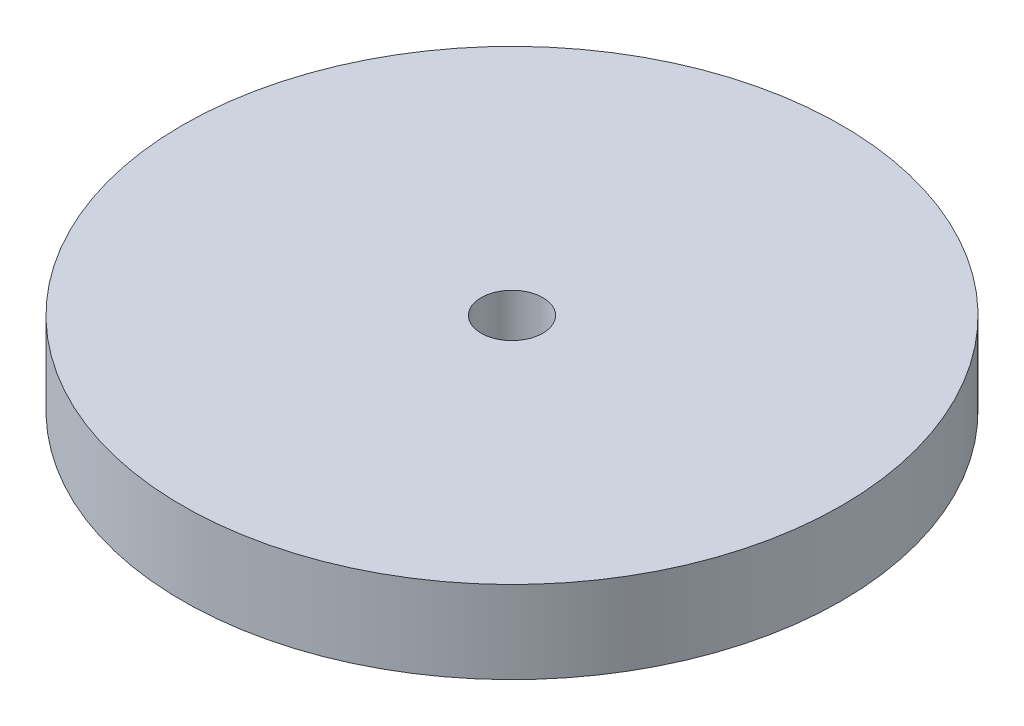
ISO-10303-21;
HEADER;
FILE_DESCRIPTION(('STEP AP214'),'2;1');
FILE_NAME('part.step','',(''),(''),'','','');
FILE_SCHEMA(('AUTOMOTIVE_DESIGN { 1 0 10303 214 1 1 1 1 }'));
ENDSEC;
DATA;
#1=APPLICATION_CONTEXT('core data for automotive mechanical design processes');
#2=APPLICATION_PROTOCOL_DEFINITION('international standard','automotive_design',2000,#1);
#3=PRODUCT_CONTEXT('',#1,'mechanical');
#4=PRODUCT('Part','Part','',(#3));
#5=PRODUCT_RELATED_PRODUCT_CATEGORY('part','',(#4));
#6=PRODUCT_DEFINITION_FORMATION('','',#4);
#7=PRODUCT_DEFINITION_CONTEXT('part definition',#1,'design');
#8=PRODUCT_DEFINITION('design','',#6,#7);
#9=PRODUCT_DEFINITION_SHAPE('','',#8);
#10=(LENGTH_UNIT() NAMED_UNIT(*) SI_UNIT(.MILLI.,.METRE.));
#11=(NAMED_UNIT(*) PLANE_ANGLE_UNIT() SI_UNIT($,.RADIAN.));
#12=(NAMED_UNIT(*) SI_UNIT($,.STERADIAN.) SOLID_ANGLE_UNIT());
#13=UNCERTAINTY_MEASURE_WITH_UNIT(LENGTH_MEASURE(1.E-05),#10,'distance_accuracy_value','');
#14=(GEOMETRIC_REPRESENTATION_CONTEXT(3) GLOBAL_UNCERTAINTY_ASSIGNED_CONTEXT((#13)) GLOBAL_UNIT_ASSIGNED_CONTEXT((#10,
#11,#12)) REPRESENTATION_CONTEXT('',''));
#15=CARTESIAN_POINT('',(0.,0.,0.));
#16=DIRECTION('',(0.,0.,1.));
#17=DIRECTION('',(1.,0.,0.));
#18=AXIS2_PLACEMENT_3D('',#15,#16,#17);
#19=CARTESIAN_POINT('',(-38.1,4.7625,76.2));
#20=DIRECTION('',(0.,-1.,0.));
#21=DIRECTION('',(1.,0.,0.));
#22=AXIS2_PLACEMENT_3D('',#19,#20,#21);
#23=PLANE('',#22);
#24=CARTESIAN_POINT('',(0.,4.7625,38.1));
#25=DIRECTION('',(0.,1.,0.));
#26=DIRECTION('',(-1.,0.,0.));
#27=AXIS2_PLACEMENT_3D('',#24,#25,#26);
#28=CIRCLE('',#27,3.5687);
#29=CARTESIAN_POINT('',(-3.56870000000001,4.7625,38.1));
#30=VERTEX_POINT('',#29);
#31=EDGE_CURVE('E46',#30,#30,#28,.T.);
#32=ORIENTED_EDGE('',*,*,#31,.F.);
#33=EDGE_LOOP('',(#32));
#34=FACE_BOUND('',#33,.T.);
#35=CARTESIAN_POINT('',(0.,4.7625,38.1));
#36=DIRECTION('',(0.,1.,0.));
#37=DIRECTION('',(-1.,0.,0.));
#38=AXIS2_PLACEMENT_3D('',#35,#36,#37);
#39=CIRCLE('',#38,38.1);
#40=CARTESIAN_POINT('',(-38.1,4.7625,38.1));
#41=VERTEX_POINT('',#40);
#42=EDGE_CURVE('E57',#41,#41,#39,.T.);
#43=ORIENTED_EDGE('',*,*,#42,.T.);
#44=EDGE_LOOP('',(#43));
#45=FACE_BOUND('',#44,.T.);
#46=ADVANCED_FACE('F43',(#34,#45),#23,.F.);
#47=CARTESIAN_POINT('',(-38.1,-4.7625,76.2));
#48=DIRECTION('',(0.,1.,0.));
#49=DIRECTION('',(0.,0.,1.));
#50=AXIS2_PLACEMENT_3D('',#47,#48,#49);
#51=PLANE('',#50);
#52=CARTESIAN_POINT('',(0.,-4.7625,38.1));
#53=DIRECTION('',(0.,1.,0.));
#54=DIRECTION('',(-1.,0.,0.));
#55=AXIS2_PLACEMENT_3D('',#52,#53,#54);
#56=CIRCLE('',#55,3.5687);
#57=CARTESIAN_POINT('',(-3.56870000000001,-4.7625,38.1));
#58=VERTEX_POINT('',#57);
#59=EDGE_CURVE('E10',#58,#58,#56,.T.);
#60=ORIENTED_EDGE('',*,*,#59,.T.);
#61=EDGE_LOOP('',(#60));
#62=FACE_BOUND('',#61,.T.);
#63=CARTESIAN_POINT('',(0.,-4.7625,38.1));
#64=DIRECTION('',(0.,1.,0.));
#65=DIRECTION('',(0.,0.,1.));
#66=AXIS2_PLACEMENT_3D('',#63,#64,#65);
#67=CIRCLE('',#66,38.1);
#68=CARTESIAN_POINT('',(-38.1,-4.7625,38.1));
#69=VERTEX_POINT('',#68);
#70=EDGE_CURVE('E53',#69,#69,#67,.T.);
#71=ORIENTED_EDGE('',*,*,#70,.F.);
#72=EDGE_LOOP('',(#71));
#73=FACE_BOUND('',#72,.T.);
#74=ADVANCED_FACE('F69',(#62,#73),#51,.F.);
#75=CARTESIAN_POINT('',(0.,-4.7625,38.1));
#76=DIRECTION('',(0.,1.,0.));
#77=DIRECTION('',(-1.,0.,0.));
#78=AXIS2_PLACEMENT_3D('',#75,#76,#77);
#79=CYLINDRICAL_SURFACE('',#78,3.5687);
#80=ORIENTED_EDGE('',*,*,#59,.F.);
#81=EDGE_LOOP('',(#80));
#82=FACE_BOUND('',#81,.T.);
#83=ORIENTED_EDGE('',*,*,#31,.T.);
#84=EDGE_LOOP('',(#83));
#85=FACE_BOUND('',#84,.T.);
#86=ADVANCED_FACE('F65',(#82,#85),#79,.F.);
#87=CARTESIAN_POINT('',(0.,-7.9375,38.1));
#88=DIRECTION('',(0.,1.,0.));
#89=DIRECTION('',(-1.,0.,0.));
#90=AXIS2_PLACEMENT_3D('',#87,#88,#89);
#91=CYLINDRICAL_SURFACE('',#90,38.1);
#92=CARTESIAN_POINT('',(-38.1,4.7625,38.1));
#93=CARTESIAN_POINT('',(-38.1,4.66328125,38.1));
#94=CARTESIAN_POINT('',(-38.1,4.5640625,38.1));
#95=CARTESIAN_POINT('',(-38.1,4.365625,38.1));
#96=CARTESIAN_POINT('',(-38.1,4.26640625,38.1));
#97=CARTESIAN_POINT('',(-38.1,4.06796875,38.1));
#98=CARTESIAN_POINT('',(-38.1,3.96875,38.1));
#99=CARTESIAN_POINT('',(-38.1,3.7703125,38.1));
#100=CARTESIAN_POINT('',(-38.1,3.67109375,38.1));
#101=CARTESIAN_POINT('',(-38.1,3.47265625,38.1));
#102=CARTESIAN_POINT('',(-38.1,3.3734375,38.1));
#103=CARTESIAN_POINT('',(-38.1,3.175,38.1));
#104=CARTESIAN_POINT('',(-38.1,3.07578125,38.1));
#105=CARTESIAN_POINT('',(-38.1,2.87734375,38.1));
#106=CARTESIAN_POINT('',(-38.1,2.778125,38.1));
#107=CARTESIAN_POINT('',(-38.1,2.5796875,38.1));
#108=CARTESIAN_POINT('',(-38.1,2.48046875,38.1));
#109=CARTESIAN_POINT('',(-38.1,2.28203125,38.1));
#110=CARTESIAN_POINT('',(-38.1,2.1828125,38.1));
#111=CARTESIAN_POINT('',(-38.1,1.984375,38.1));
#112=CARTESIAN_POINT('',(-38.1,1.88515625,38.1));
#113=CARTESIAN_POINT('',(-38.1,1.68671875,38.1));
#114=CARTESIAN_POINT('',(-38.1,1.5875,38.1));
#115=CARTESIAN_POINT('',(-38.1,1.3890625,38.1));
#116=CARTESIAN_POINT('',(-38.1,1.28984375,38.1));
#117=CARTESIAN_POINT('',(-38.1,1.09140625,38.1));
#118=CARTESIAN_POINT('',(-38.1,0.992187500000001,38.1));
#119=CARTESIAN_POINT('',(-38.1,0.793750000000001,38.1));
#120=CARTESIAN_POINT('',(-38.1,0.69453125,38.1));
#121=CARTESIAN_POINT('',(-38.1,0.49609375,38.1));
#122=CARTESIAN_POINT('',(-38.1,0.396875,38.1));
#123=CARTESIAN_POINT('',(-38.1,0.1984375,38.1));
#124=CARTESIAN_POINT('',(-38.1,0.0992187500000001,38.1));
#125=CARTESIAN_POINT('',(-38.1,-0.0992187499999998,38.1));
#126=CARTESIAN_POINT('',(-38.1,-0.1984375,38.1));
#127=CARTESIAN_POINT('',(-38.1,-0.396874999999999,38.1));
#128=CARTESIAN_POINT('',(-38.1,-0.496093749999999,38.1));
#129=CARTESIAN_POINT('',(-38.1,-0.694531249999999,38.1));
#130=CARTESIAN_POINT('',(-38.1,-0.79375,38.1));
#131=CARTESIAN_POINT('',(-38.1,-0.9921875,38.1));
#132=CARTESIAN_POINT('',(-38.1,-1.09140625,38.1));
#133=CARTESIAN_POINT('',(-38.1,-1.28984375,38.1));
#134=CARTESIAN_POINT('',(-38.1,-1.3890625,38.1));
#135=CARTESIAN_POINT('',(-38.1,-1.5875,38.1));
#136=CARTESIAN_POINT('',(-38.1,-1.68671875,38.1));
#137=CARTESIAN_POINT('',(-38.1,-1.88515625,38.1));
#138=CARTESIAN_POINT('',(-38.1,-1.984375,38.1));
#139=CARTESIAN_POINT('',(-38.1,-2.1828125,38.1));
#140=CARTESIAN_POINT('',(-38.1,-2.28203125,38.1));
#141=CARTESIAN_POINT('',(-38.1,-2.48046875,38.1));
#142=CARTESIAN_POINT('',(-38.1,-2.5796875,38.1));
#143=CARTESIAN_POINT('',(-38.1,-2.778125,38.1));
#144=CARTESIAN_POINT('',(-38.1,-2.87734375,38.1));
#145=CARTESIAN_POINT('',(-38.1,-3.07578125,38.1));
#146=CARTESIAN_POINT('',(-38.1,-3.175,38.1));
#147=CARTESIAN_POINT('',(-38.1,-3.3734375,38.1));
#148=CARTESIAN_POINT('',(-38.1,-3.47265625,38.1));
#149=CARTESIAN_POINT('',(-38.1,-3.67109375,38.1));
#150=CARTESIAN_POINT('',(-38.1,-3.7703125,38.1));
#151=CARTESIAN_POINT('',(-38.1,-3.96875,38.1));
#152=CARTESIAN_POINT('',(-38.1,-4.06796875,38.1));
#153=CARTESIAN_POINT('',(-38.1,-4.26640625,38.1));
#154=CARTESIAN_POINT('',(-38.1,-4.365625,38.1));
#155=CARTESIAN_POINT('',(-38.1,-4.5640625,38.1));
#156=CARTESIAN_POINT('',(-38.1,-4.66328125,38.1));
#157=CARTESIAN_POINT('',(-38.1,-4.7625,38.1));
#158=B_SPLINE_CURVE_WITH_KNOTS('',3,(#92,#93,#94,#95,#96,#97,#98,#99,#100,#101,#102,#103,#104,
#105,#106,#107,#108,#109,#110,#111,#112,#113,#114,#115,#116,#117,#118,#119,#120,#121,#122,#123,
#124,#125,#126,#127,#128,#129,#130,#131,#132,#133,#134,#135,#136,#137,#138,#139,#140,#141,#142,
#143,#144,#145,#146,#147,#148,#149,#150,#151,#152,#153,#154,#155,#156,#157),.UNSPECIFIED.,.F.,
.F.,(4,2,2,2,2,2,2,2,2,2,2,2,2,2,2,2,2,2,2,2,2,2,2,2,2,2,2,2,2,2,2,2,4),(0.,0.29765625,
0.5953125,0.892968750000001,1.190625,1.48828125,1.7859375,2.08359375,2.38125,2.67890625,
2.9765625,3.27421875,3.571875,3.86953125,4.1671875,4.46484375,4.7625,5.06015625,5.3578125,
5.65546875,5.953125,6.25078125,6.5484375,6.84609375,7.14375,7.44140625,7.7390625,8.03671875,
8.334375,8.63203125,8.9296875,9.22734375,9.525),.UNSPECIFIED.);
#159=EDGE_CURVE('BSEAM62',#41,#69,#158,.T.);
#160=ORIENTED_EDGE('',*,*,#42,.F.);
#161=ORIENTED_EDGE('',*,*,#70,.T.);
#162=ORIENTED_EDGE('',*,*,#159,.T.);
#163=ORIENTED_EDGE('',*,*,#159,.F.);
#164=EDGE_LOOP('',(#160,#162,#161,#163));
#165=FACE_BOUND('',#164,.T.);
#166=ADVANCED_FACE('F62',(#165),#91,.T.);
#167=CLOSED_SHELL('',(#46,#74,#86,#166));
#168=MANIFOLD_SOLID_BREP('B2',#167);
#169=ADVANCED_BREP_SHAPE_REPRESENTATION('',(#18,#168),#14);
#170=SHAPE_DEFINITION_REPRESENTATION(#9,#169);
ENDSEC;
END-ISO-10303-21;
